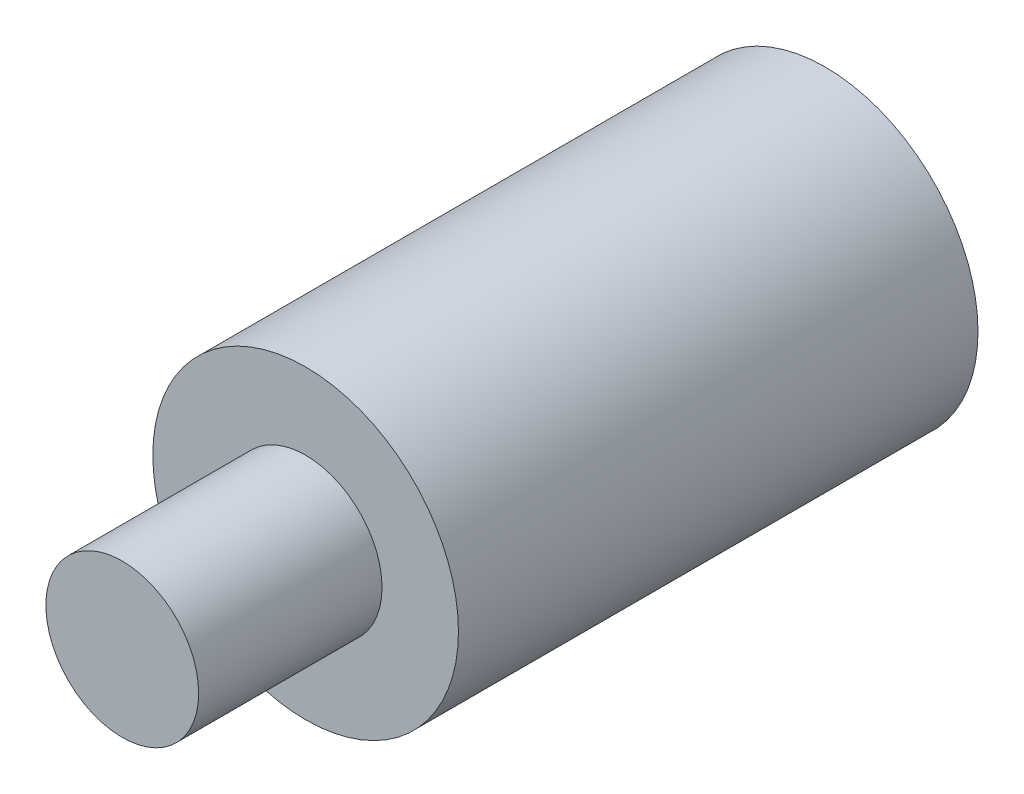
ISO-10303-21;
HEADER;
FILE_DESCRIPTION(('STEP AP214'),'2;1');
FILE_NAME('part.step','',(''),(''),'','','');
FILE_SCHEMA(('AUTOMOTIVE_DESIGN { 1 0 10303 214 1 1 1 1 }'));
ENDSEC;
DATA;
#1=APPLICATION_CONTEXT('core data for automotive mechanical design processes');
#2=APPLICATION_PROTOCOL_DEFINITION('international standard','automotive_design',2000,#1);
#3=PRODUCT_CONTEXT('',#1,'mechanical');
#4=PRODUCT('Part','Part','',(#3));
#5=PRODUCT_RELATED_PRODUCT_CATEGORY('part','',(#4));
#6=PRODUCT_DEFINITION_FORMATION('','',#4);
#7=PRODUCT_DEFINITION_CONTEXT('part definition',#1,'design');
#8=PRODUCT_DEFINITION('design','',#6,#7);
#9=PRODUCT_DEFINITION_SHAPE('','',#8);
#10=(LENGTH_UNIT() NAMED_UNIT(*) SI_UNIT(.MILLI.,.METRE.));
#11=(NAMED_UNIT(*) PLANE_ANGLE_UNIT() SI_UNIT($,.RADIAN.));
#12=(NAMED_UNIT(*) SI_UNIT($,.STERADIAN.) SOLID_ANGLE_UNIT());
#13=UNCERTAINTY_MEASURE_WITH_UNIT(LENGTH_MEASURE(1.E-05),#10,'distance_accuracy_value','');
#14=(GEOMETRIC_REPRESENTATION_CONTEXT(3) GLOBAL_UNCERTAINTY_ASSIGNED_CONTEXT((#13)) GLOBAL_UNIT_ASSIGNED_CONTEXT((#10,
#11,#12)) REPRESENTATION_CONTEXT('',''));
#15=CARTESIAN_POINT('',(0.,0.,0.));
#16=DIRECTION('',(0.,0.,1.));
#17=DIRECTION('',(1.,0.,0.));
#18=AXIS2_PLACEMENT_3D('',#15,#16,#17);
#19=CARTESIAN_POINT('',(0.,0.,34.));
#20=DIRECTION('',(0.,0.,-1.));
#21=DIRECTION('',(-1.,0.,0.));
#22=AXIS2_PLACEMENT_3D('',#19,#20,#21);
#23=CYLINDRICAL_SURFACE('',#22,10.);
#24=CARTESIAN_POINT('',(0.,0.,34.));
#25=DIRECTION('',(0.,0.,1.));
#26=DIRECTION('',(1.,0.,0.));
#27=AXIS2_PLACEMENT_3D('',#24,#25,#26);
#28=CIRCLE('',#27,10.);
#29=CARTESIAN_POINT('',(10.,0.,34.));
#30=VERTEX_POINT('',#29);
#31=EDGE_CURVE('E39',#30,#30,#28,.T.);
#32=ORIENTED_EDGE('',*,*,#31,.F.);
#33=EDGE_LOOP('',(#32));
#34=FACE_BOUND('',#33,.T.);
#35=CARTESIAN_POINT('',(0.,0.,0.));
#36=DIRECTION('',(0.,0.,1.));
#37=DIRECTION('',(1.,0.,0.));
#38=AXIS2_PLACEMENT_3D('',#35,#36,#37);
#39=CIRCLE('',#38,10.);
#40=CARTESIAN_POINT('',(10.,0.,0.));
#41=VERTEX_POINT('',#40);
#42=EDGE_CURVE('E35',#41,#41,#39,.T.);
#43=ORIENTED_EDGE('',*,*,#42,.T.);
#44=EDGE_LOOP('',(#43));
#45=FACE_BOUND('',#44,.T.);
#46=ADVANCED_FACE('F32',(#34,#45),#23,.T.);
#47=CARTESIAN_POINT('',(0.,0.,34.));
#48=DIRECTION('',(0.,0.,1.));
#49=DIRECTION('',(1.,0.,0.));
#50=AXIS2_PLACEMENT_3D('',#47,#48,#49);
#51=PLANE('',#50);
#52=CARTESIAN_POINT('',(0.,0.,34.));
#53=DIRECTION('',(0.,0.,1.));
#54=DIRECTION('',(1.,0.,0.));
#55=AXIS2_PLACEMENT_3D('',#52,#53,#54);
#56=CIRCLE('',#55,5.);
#57=CARTESIAN_POINT('',(5.,0.,34.));
#58=VERTEX_POINT('',#57);
#59=EDGE_CURVE('E10',#58,#58,#56,.T.);
#60=ORIENTED_EDGE('',*,*,#59,.F.);
#61=EDGE_LOOP('',(#60));
#62=FACE_BOUND('',#61,.T.);
#63=ORIENTED_EDGE('',*,*,#31,.T.);
#64=EDGE_LOOP('',(#63));
#65=FACE_BOUND('',#64,.T.);
#66=ADVANCED_FACE('F56',(#62,#65),#51,.T.);
#67=CARTESIAN_POINT('',(0.,0.,0.));
#68=DIRECTION('',(0.,0.,1.));
#69=DIRECTION('',(1.,0.,0.));
#70=AXIS2_PLACEMENT_3D('',#67,#68,#69);
#71=PLANE('',#70);
#72=ORIENTED_EDGE('',*,*,#42,.F.);
#73=EDGE_LOOP('',(#72));
#74=FACE_BOUND('',#73,.T.);
#75=ADVANCED_FACE('F53',(#74),#71,.F.);
#76=CARTESIAN_POINT('',(0.,0.,46.));
#77=DIRECTION('',(0.,0.,-1.));
#78=DIRECTION('',(-1.,0.,0.));
#79=AXIS2_PLACEMENT_3D('',#76,#77,#78);
#80=CYLINDRICAL_SURFACE('',#79,5.);
#81=CARTESIAN_POINT('',(0.,0.,46.));
#82=DIRECTION('',(0.,0.,1.));
#83=DIRECTION('',(1.,0.,0.));
#84=AXIS2_PLACEMENT_3D('',#81,#82,#83);
#85=CIRCLE('',#84,5.);
#86=CARTESIAN_POINT('',(5.,0.,46.));
#87=VERTEX_POINT('',#86);
#88=EDGE_CURVE('E45',#87,#87,#85,.T.);
#89=ORIENTED_EDGE('',*,*,#88,.F.);
#90=EDGE_LOOP('',(#89));
#91=FACE_BOUND('',#90,.T.);
#92=ORIENTED_EDGE('',*,*,#59,.T.);
#93=EDGE_LOOP('',(#92));
#94=FACE_BOUND('',#93,.T.);
#95=ADVANCED_FACE('F55',(#91,#94),#80,.T.);
#96=CARTESIAN_POINT('',(0.,0.,46.));
#97=DIRECTION('',(0.,0.,1.));
#98=DIRECTION('',(1.,0.,0.));
#99=AXIS2_PLACEMENT_3D('',#96,#97,#98);
#100=PLANE('',#99);
#101=ORIENTED_EDGE('',*,*,#88,.T.);
#102=EDGE_LOOP('',(#101));
#103=FACE_BOUND('',#102,.T.);
#104=ADVANCED_FACE('F61',(#103),#100,.T.);
#105=CLOSED_SHELL('',(#46,#66,#75,#95,#104));
#106=MANIFOLD_SOLID_BREP('B2',#105);
#107=ADVANCED_BREP_SHAPE_REPRESENTATION('',(#18,#106),#14);
#108=SHAPE_DEFINITION_REPRESENTATION(#9,#107);
ENDSEC;
END-ISO-10303-21;
